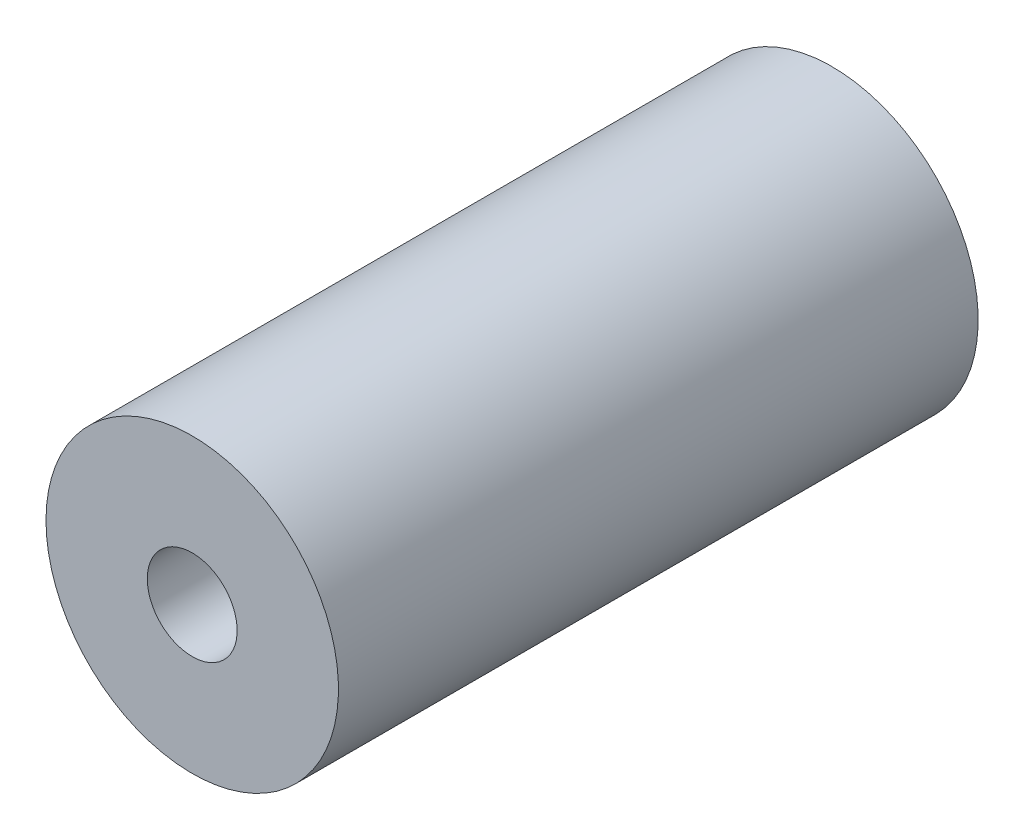
ISO-10303-21;
HEADER;
FILE_DESCRIPTION(('STEP AP214'),'2;1');
FILE_NAME('part.step','',(''),(''),'','','');
FILE_SCHEMA(('AUTOMOTIVE_DESIGN { 1 0 10303 214 1 1 1 1 }'));
ENDSEC;
DATA;
#1=APPLICATION_CONTEXT('core data for automotive mechanical design processes');
#2=APPLICATION_PROTOCOL_DEFINITION('international standard','automotive_design',2000,#1);
#3=PRODUCT_CONTEXT('',#1,'mechanical');
#4=PRODUCT('Part','Part','',(#3));
#5=PRODUCT_RELATED_PRODUCT_CATEGORY('part','',(#4));
#6=PRODUCT_DEFINITION_FORMATION('','',#4);
#7=PRODUCT_DEFINITION_CONTEXT('part definition',#1,'design');
#8=PRODUCT_DEFINITION('design','',#6,#7);
#9=PRODUCT_DEFINITION_SHAPE('','',#8);
#10=(LENGTH_UNIT() NAMED_UNIT(*) SI_UNIT(.MILLI.,.METRE.));
#11=(NAMED_UNIT(*) PLANE_ANGLE_UNIT() SI_UNIT($,.RADIAN.));
#12=(NAMED_UNIT(*) SI_UNIT($,.STERADIAN.) SOLID_ANGLE_UNIT());
#13=UNCERTAINTY_MEASURE_WITH_UNIT(LENGTH_MEASURE(1.E-05),#10,'distance_accuracy_value','');
#14=(GEOMETRIC_REPRESENTATION_CONTEXT(3) GLOBAL_UNCERTAINTY_ASSIGNED_CONTEXT((#13)) GLOBAL_UNIT_ASSIGNED_CONTEXT((#10,
#11,#12)) REPRESENTATION_CONTEXT('',''));
#15=CARTESIAN_POINT('',(0.,0.,0.));
#16=DIRECTION('',(0.,0.,1.));
#17=DIRECTION('',(1.,0.,0.));
#18=AXIS2_PLACEMENT_3D('',#15,#16,#17);
#19=CARTESIAN_POINT('',(1.75,0.,0.));
#20=DIRECTION('',(0.,0.,-1.));
#21=DIRECTION('',(-1.,0.,0.));
#22=AXIS2_PLACEMENT_3D('',#19,#20,#21);
#23=PLANE('',#22);
#24=CARTESIAN_POINT('',(0.,0.,0.));
#25=DIRECTION('',(0.,0.,-1.));
#26=DIRECTION('',(-1.,0.,0.));
#27=AXIS2_PLACEMENT_3D('',#24,#25,#26);
#28=CIRCLE('',#27,8.);
#29=CARTESIAN_POINT('',(-8.,0.,0.));
#30=VERTEX_POINT('',#29);
#31=EDGE_CURVE('E10',#30,#30,#28,.T.);
#32=ORIENTED_EDGE('',*,*,#31,.T.);
#33=EDGE_LOOP('',(#32));
#34=FACE_BOUND('',#33,.T.);
#35=CARTESIAN_POINT('',(0.,0.,0.));
#36=DIRECTION('',(0.,0.,-1.));
#37=DIRECTION('',(-1.,0.,0.));
#38=AXIS2_PLACEMENT_3D('',#35,#36,#37);
#39=CIRCLE('',#38,1.75);
#40=CARTESIAN_POINT('',(-1.75,0.,0.));
#41=VERTEX_POINT('',#40);
#42=EDGE_CURVE('E52',#41,#41,#39,.T.);
#43=ORIENTED_EDGE('',*,*,#42,.F.);
#44=EDGE_LOOP('',(#43));
#45=FACE_BOUND('',#44,.T.);
#46=ADVANCED_FACE('F30',(#34,#45),#23,.T.);
#47=CARTESIAN_POINT('',(0.,0.,35.));
#48=DIRECTION('',(0.,0.,-1.));
#49=DIRECTION('',(-1.,0.,0.));
#50=AXIS2_PLACEMENT_3D('',#47,#48,#49);
#51=CYLINDRICAL_SURFACE('',#50,8.);
#52=CARTESIAN_POINT('',(0.,0.,35.));
#53=DIRECTION('',(0.,0.,-1.));
#54=DIRECTION('',(-1.,0.,0.));
#55=AXIS2_PLACEMENT_3D('',#52,#53,#54);
#56=CIRCLE('',#55,8.);
#57=CARTESIAN_POINT('',(-8.,0.,35.));
#58=VERTEX_POINT('',#57);
#59=EDGE_CURVE('E36',#58,#58,#56,.T.);
#60=ORIENTED_EDGE('',*,*,#59,.T.);
#61=EDGE_LOOP('',(#60));
#62=FACE_BOUND('',#61,.T.);
#63=ORIENTED_EDGE('',*,*,#31,.F.);
#64=EDGE_LOOP('',(#63));
#65=FACE_BOUND('',#64,.T.);
#66=ADVANCED_FACE('F60',(#62,#65),#51,.T.);
#67=CARTESIAN_POINT('',(8.,0.,35.));
#68=DIRECTION('',(0.,0.,1.));
#69=DIRECTION('',(1.,0.,0.));
#70=AXIS2_PLACEMENT_3D('',#67,#68,#69);
#71=PLANE('',#70);
#72=CARTESIAN_POINT('',(0.,0.,35.));
#73=DIRECTION('',(0.,0.,-1.));
#74=DIRECTION('',(-1.,0.,0.));
#75=AXIS2_PLACEMENT_3D('',#72,#73,#74);
#76=CIRCLE('',#75,2.4585);
#77=CARTESIAN_POINT('',(-2.4585,0.,35.));
#78=VERTEX_POINT('',#77);
#79=EDGE_CURVE('E40',#78,#78,#76,.T.);
#80=ORIENTED_EDGE('',*,*,#79,.T.);
#81=EDGE_LOOP('',(#80));
#82=FACE_BOUND('',#81,.T.);
#83=ORIENTED_EDGE('',*,*,#59,.F.);
#84=EDGE_LOOP('',(#83));
#85=FACE_BOUND('',#84,.T.);
#86=ADVANCED_FACE('F64',(#82,#85),#71,.T.);
#87=CARTESIAN_POINT('',(0.,0.,35.));
#88=DIRECTION('',(0.,0.,-1.));
#89=DIRECTION('',(-1.,0.,0.));
#90=AXIS2_PLACEMENT_3D('',#87,#88,#89);
#91=CYLINDRICAL_SURFACE('',#90,2.4585);
#92=CARTESIAN_POINT('',(0.,0.,20.));
#93=DIRECTION('',(0.,0.,-1.));
#94=DIRECTION('',(-1.,0.,0.));
#95=AXIS2_PLACEMENT_3D('',#92,#93,#94);
#96=CIRCLE('',#95,2.4585);
#97=CARTESIAN_POINT('',(-2.4585,0.,20.));
#98=VERTEX_POINT('',#97);
#99=EDGE_CURVE('E44',#98,#98,#96,.T.);
#100=ORIENTED_EDGE('',*,*,#99,.T.);
#101=EDGE_LOOP('',(#100));
#102=FACE_BOUND('',#101,.T.);
#103=ORIENTED_EDGE('',*,*,#79,.F.);
#104=EDGE_LOOP('',(#103));
#105=FACE_BOUND('',#104,.T.);
#106=ADVANCED_FACE('F68',(#102,#105),#91,.F.);
#107=CARTESIAN_POINT('',(0.,0.,20.));
#108=DIRECTION('',(0.,0.,1.));
#109=DIRECTION('',(1.,0.,0.));
#110=AXIS2_PLACEMENT_3D('',#107,#108,#109);
#111=CONICAL_SURFACE('',#110,2.4585,1.02974425867666);
#112=CARTESIAN_POINT('',(0.,0.,19.574290251419));
#113=DIRECTION('',(0.,0.,-1.));
#114=DIRECTION('',(-1.,0.,0.));
#115=AXIS2_PLACEMENT_3D('',#112,#113,#114);
#116=CIRCLE('',#115,1.75);
#117=CARTESIAN_POINT('',(-1.75,0.,19.574290251419));
#118=VERTEX_POINT('',#117);
#119=EDGE_CURVE('E49',#118,#118,#116,.T.);
#120=ORIENTED_EDGE('',*,*,#119,.T.);
#121=EDGE_LOOP('',(#120));
#122=FACE_BOUND('',#121,.T.);
#123=ORIENTED_EDGE('',*,*,#99,.F.);
#124=EDGE_LOOP('',(#123));
#125=FACE_BOUND('',#124,.T.);
#126=ADVANCED_FACE('F75',(#122,#125),#111,.F.);
#127=CARTESIAN_POINT('',(0.,0.,35.));
#128=DIRECTION('',(0.,0.,-1.));
#129=DIRECTION('',(-1.,0.,0.));
#130=AXIS2_PLACEMENT_3D('',#127,#128,#129);
#131=CYLINDRICAL_SURFACE('',#130,1.75);
#132=ORIENTED_EDGE('',*,*,#42,.T.);
#133=EDGE_LOOP('',(#132));
#134=FACE_BOUND('',#133,.T.);
#135=ORIENTED_EDGE('',*,*,#119,.F.);
#136=EDGE_LOOP('',(#135));
#137=FACE_BOUND('',#136,.T.);
#138=ADVANCED_FACE('F56',(#134,#137),#131,.F.);
#139=CLOSED_SHELL('',(#46,#66,#86,#106,#126,#138));
#140=MANIFOLD_SOLID_BREP('B2',#139);
#141=ADVANCED_BREP_SHAPE_REPRESENTATION('',(#18,#140),#14);
#142=SHAPE_DEFINITION_REPRESENTATION(#9,#141);
ENDSEC;
END-ISO-10303-21;
